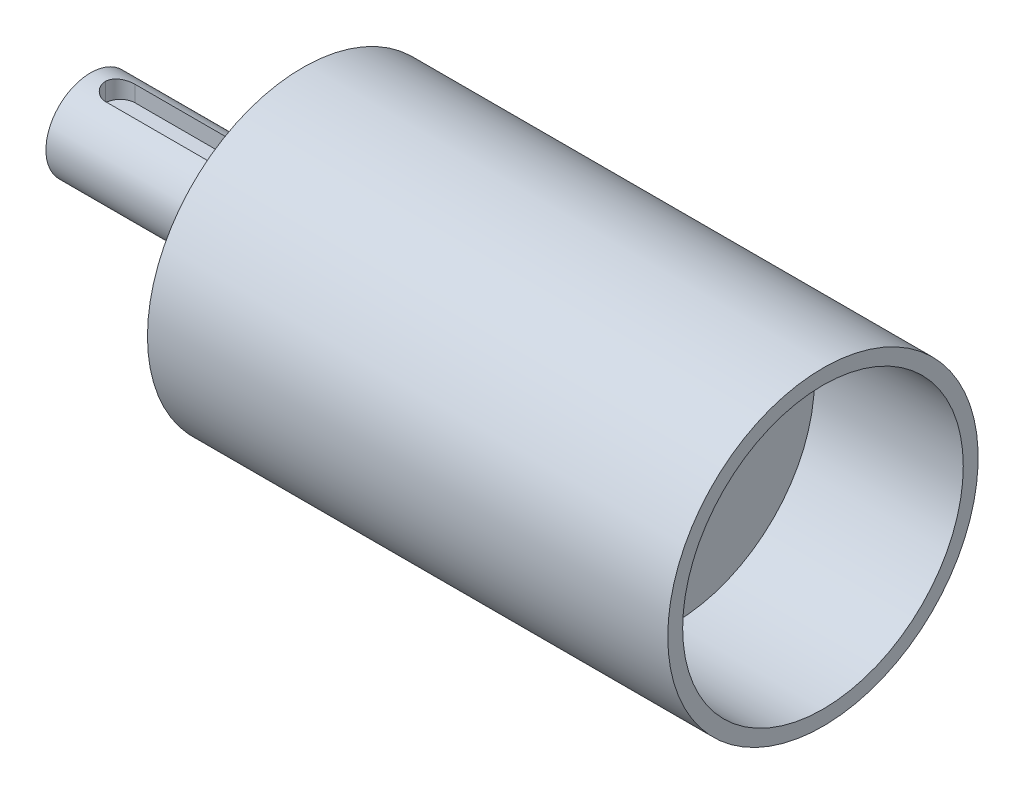
ISO-10303-21;
HEADER;
FILE_DESCRIPTION(('STEP AP214'),'2;1');
FILE_NAME('part.step','',(''),(''),'','','');
FILE_SCHEMA(('AUTOMOTIVE_DESIGN { 1 0 10303 214 1 1 1 1 }'));
ENDSEC;
DATA;
#1=APPLICATION_CONTEXT('core data for automotive mechanical design processes');
#2=APPLICATION_PROTOCOL_DEFINITION('international standard','automotive_design',2000,#1);
#3=PRODUCT_CONTEXT('',#1,'mechanical');
#4=PRODUCT('Part','Part','',(#3));
#5=PRODUCT_RELATED_PRODUCT_CATEGORY('part','',(#4));
#6=PRODUCT_DEFINITION_FORMATION('','',#4);
#7=PRODUCT_DEFINITION_CONTEXT('part definition',#1,'design');
#8=PRODUCT_DEFINITION('design','',#6,#7);
#9=PRODUCT_DEFINITION_SHAPE('','',#8);
#10=(LENGTH_UNIT() NAMED_UNIT(*) SI_UNIT(.MILLI.,.METRE.));
#11=(NAMED_UNIT(*) PLANE_ANGLE_UNIT() SI_UNIT($,.RADIAN.));
#12=(NAMED_UNIT(*) SI_UNIT($,.STERADIAN.) SOLID_ANGLE_UNIT());
#13=UNCERTAINTY_MEASURE_WITH_UNIT(LENGTH_MEASURE(1.E-05),#10,'distance_accuracy_value','');
#14=(GEOMETRIC_REPRESENTATION_CONTEXT(3) GLOBAL_UNCERTAINTY_ASSIGNED_CONTEXT((#13)) GLOBAL_UNIT_ASSIGNED_CONTEXT((#10,
#11,#12)) REPRESENTATION_CONTEXT('',''));
#15=CARTESIAN_POINT('',(0.,0.,0.));
#16=DIRECTION('',(0.,0.,1.));
#17=DIRECTION('',(1.,0.,0.));
#18=AXIS2_PLACEMENT_3D('',#15,#16,#17);
#19=CARTESIAN_POINT('',(25.9,0.,0.));
#20=DIRECTION('',(-1.,0.,0.));
#21=DIRECTION('',(0.,0.,1.));
#22=AXIS2_PLACEMENT_3D('',#19,#20,#21);
#23=CYLINDRICAL_SURFACE('',#22,5.99);
#24=CARTESIAN_POINT('',(0.,0.,0.));
#25=DIRECTION('',(1.,0.,0.));
#26=DIRECTION('',(0.,0.,-1.));
#27=AXIS2_PLACEMENT_3D('',#24,#25,#26);
#28=CIRCLE('',#27,5.99);
#29=CARTESIAN_POINT('',(0.,0.,-5.99));
#30=VERTEX_POINT('',#29);
#31=EDGE_CURVE('E118',#30,#30,#28,.T.);
#32=ORIENTED_EDGE('',*,*,#31,.T.);
#33=EDGE_LOOP('',(#32));
#34=FACE_BOUND('',#33,.T.);
#35=CARTESIAN_POINT('',(25.9,0.,0.));
#36=DIRECTION('',(1.,0.,0.));
#37=DIRECTION('',(0.,0.,-1.));
#38=AXIS2_PLACEMENT_3D('',#35,#36,#37);
#39=CIRCLE('',#38,5.99);
#40=CARTESIAN_POINT('',(25.9,0.,-5.99));
#41=VERTEX_POINT('',#40);
#42=EDGE_CURVE('E114',#41,#41,#39,.T.);
#43=ORIENTED_EDGE('',*,*,#42,.F.);
#44=EDGE_LOOP('',(#43));
#45=FACE_BOUND('',#44,.T.);
#46=CARTESIAN_POINT('',(20.,5.64624654084464,-2.));
#47=CARTESIAN_POINT('',(20.0545772254101,5.64624111920466,-2.00000150142005));
#48=CARTESIAN_POINT('',(20.1091265843497,5.64703886653188,-1.99776455751104));
#49=CARTESIAN_POINT('',(20.2178019552134,5.65018567229273,-1.98885277168999));
#50=CARTESIAN_POINT('',(20.2719280777978,5.65253431050127,-1.9821791319294));
#51=CARTESIAN_POINT('',(20.4327447969426,5.66180052844837,-1.95562915457593));
#52=CARTESIAN_POINT('',(20.5383057456413,5.67093927118224,-1.9292230365146));
#53=CARTESIAN_POINT('',(20.7431638927426,5.69403166927295,-1.85995042804286));
#54=CARTESIAN_POINT('',(20.842464423125,5.70798273733851,-1.81709278121317));
#55=CARTESIAN_POINT('',(21.0325566876376,5.73911751354651,-1.71621952255672));
#56=CARTESIAN_POINT('',(21.1233428197958,5.75630332791377,-1.6581940249353));
#57=CARTESIAN_POINT('',(21.2973029819165,5.79271898526574,-1.52621934176412));
#58=CARTESIAN_POINT('',(21.3800938350862,5.81199964668334,-1.4517792243794));
#59=CARTESIAN_POINT('',(21.5322845903454,5.85000481735862,-1.29012739459433));
#60=CARTESIAN_POINT('',(21.6016817814633,5.86872921337672,-1.20291310288123));
#61=CARTESIAN_POINT('',(21.7268783021557,5.90410855984005,-1.01535117190145));
#62=CARTESIAN_POINT('',(21.7822683075113,5.9206954770443,-0.914716623643645));
#63=CARTESIAN_POINT('',(21.875148896941,5.949312973737,-0.704943660362393));
#64=CARTESIAN_POINT('',(21.9126563774084,5.96134785201078,-0.595813386461911));
#65=CARTESIAN_POINT('',(21.9602197055108,5.97680587206533,-0.405169825918822));
#66=CARTESIAN_POINT('',(21.9751012829965,5.98171974860905,-0.32494936472452));
#67=CARTESIAN_POINT('',(21.9950044337159,5.988332022573,-0.163170084738659));
#68=CARTESIAN_POINT('',(22.0000263764121,5.99003054047981,-0.0816113162119529));
#69=CARTESIAN_POINT('',(22.,5.99,0.));
#70=B_SPLINE_CURVE_WITH_KNOTS('',3,(#46,#47,#48,#49,#50,#51,#52,#53,#54,#55,#56,#57,#58,#59,#60,
#61,#62,#63,#64,#65,#66,#67,#68,#69),.UNSPECIFIED.,.F.,.F.,(4,2,2,2,2,2,2,2,2,2,2,4),(0.,
0.163625649975165,0.327206982581535,0.65309094193572,0.978799965914939,1.30472180553101,
1.64217985811905,1.97970614312829,2.32618169449264,2.6723292247203,2.91690445867158,
3.16147052766792),.UNSPECIFIED.);
#71=CARTESIAN_POINT('',(20.,5.64624654084464,-2.));
#72=VERTEX_POINT('',#71);
#73=CARTESIAN_POINT('',(22.,5.99,0.));
#74=VERTEX_POINT('',#73);
#75=EDGE_CURVE('E46',#72,#74,#70,.T.);
#76=ORIENTED_EDGE('',*,*,#75,.T.);
#77=CARTESIAN_POINT('',(22.,5.99,0.));
#78=CARTESIAN_POINT('',(22.0000012730635,5.9900040463816,0.0546631956011673));
#79=CARTESIAN_POINT('',(21.9977574934421,5.98925084783282,0.109298825286019));
#80=CARTESIAN_POINT('',(21.9888169927915,5.98627319657744,0.218151728395362));
#81=CARTESIAN_POINT('',(21.9821212965911,5.98404908247545,0.272369095198684));
#82=CARTESIAN_POINT('',(21.955475799514,5.97525620693805,0.433492139770829));
#83=CARTESIAN_POINT('',(21.9289669434029,5.96656627217468,0.539274739359236));
#84=CARTESIAN_POINT('',(21.8593957563344,5.94444090336522,0.744589755395238));
#85=CARTESIAN_POINT('',(21.8163393678461,5.93100717302826,0.844124400667282));
#86=CARTESIAN_POINT('',(21.7150006865404,5.90076203468457,1.03460852898133));
#87=CARTESIAN_POINT('',(21.6567102589405,5.88394882318897,1.12555338975795));
#88=CARTESIAN_POINT('',(21.5244554079997,5.84806769798296,1.29935823327725));
#89=CARTESIAN_POINT('',(21.4500599782322,5.82894593254174,1.38187889993164));
#90=CARTESIAN_POINT('',(21.2886113548137,5.79089574943314,1.53354205263574));
#91=CARTESIAN_POINT('',(21.2015543226762,5.7719673922684,1.60268046685874));
#92=CARTESIAN_POINT('',(21.0141602716922,5.73584669067053,1.72757767514161));
#93=CARTESIAN_POINT('',(20.9135095906292,5.7187212167324,1.78288658986049));
#94=CARTESIAN_POINT('',(20.7037123553614,5.68898699919098,1.87560944389763));
#95=CARTESIAN_POINT('',(20.594574951974,5.67637347058264,1.91304235526658));
#96=CARTESIAN_POINT('',(20.4041290335461,5.66014810164415,1.96042434317734));
#97=CARTESIAN_POINT('',(20.3241294295472,5.65497757594384,1.97522659852044));
#98=CARTESIAN_POINT('',(20.162771976901,5.64800755829344,1.99502868659242));
#99=CARTESIAN_POINT('',(20.0814139111966,5.64620861036118,2.00002693741128));
#100=CARTESIAN_POINT('',(20.,5.64624654084464,2.));
#101=B_SPLINE_CURVE_WITH_KNOTS('',3,(#77,#78,#79,#80,#81,#82,#83,#84,#85,#86,#87,#88,#89,#90,
#91,#92,#93,#94,#95,#96,#97,#98,#99,#100),.UNSPECIFIED.,.F.,.F.,(4,2,2,2,2,2,2,2,2,2,2,4),(0.,
0.163884393610507,0.327731074174003,0.654222635814394,0.980597058790955,1.30714611890576,
1.64384880160505,1.98065377255439,2.32729817163841,2.67357385004657,2.91750200912948,
3.16146952362764),.UNSPECIFIED.);
#102=CARTESIAN_POINT('',(20.,5.64624654084464,2.));
#103=VERTEX_POINT('',#102);
#104=EDGE_CURVE('E11',#74,#103,#101,.T.);
#105=ORIENTED_EDGE('',*,*,#104,.T.);
#106=DIRECTION('',(-1.,0.,0.));
#107=VECTOR('',#106,1.);
#108=CARTESIAN_POINT('',(22.,5.64624654084464,2.));
#109=LINE('',#108,#107);
#110=CARTESIAN_POINT('',(4.,5.64624654084464,2.));
#111=VERTEX_POINT('',#110);
#112=EDGE_CURVE('E201',#103,#111,#109,.T.);
#113=ORIENTED_EDGE('',*,*,#112,.T.);
#114=CARTESIAN_POINT('',(4.,5.64624654084464,2.));
#115=CARTESIAN_POINT('',(3.94542277458986,5.64624111920466,2.00000150142005));
#116=CARTESIAN_POINT('',(3.8908734156503,5.64703886653188,1.99776455751104));
#117=CARTESIAN_POINT('',(3.7821980447866,5.65018567229273,1.98885277168999));
#118=CARTESIAN_POINT('',(3.72807192220219,5.65253431050127,1.98217913192941));
#119=CARTESIAN_POINT('',(3.56725520305736,5.66180052844837,1.95562915457593));
#120=CARTESIAN_POINT('',(3.46169425435872,5.67093927118224,1.9292230365146));
#121=CARTESIAN_POINT('',(3.25683610725737,5.69403166927295,1.85995042804286));
#122=CARTESIAN_POINT('',(3.15753557687499,5.70798273733851,1.81709278121317));
#123=CARTESIAN_POINT('',(2.96744331236241,5.73911751354651,1.71621952255672));
#124=CARTESIAN_POINT('',(2.8766571802042,5.75630332791377,1.6581940249353));
#125=CARTESIAN_POINT('',(2.70269701808346,5.79271898526574,1.52621934176412));
#126=CARTESIAN_POINT('',(2.61990616491383,5.81199964668334,1.4517792243794));
#127=CARTESIAN_POINT('',(2.4677154096546,5.85000481735862,1.29012739459433));
#128=CARTESIAN_POINT('',(2.39831821853666,5.86872921337672,1.20291310288123));
#129=CARTESIAN_POINT('',(2.27312169784431,5.90410855984005,1.01535117190145));
#130=CARTESIAN_POINT('',(2.21773169248871,5.9206954770443,0.914716623643644));
#131=CARTESIAN_POINT('',(2.12485110305897,5.949312973737,0.704943660362392));
#132=CARTESIAN_POINT('',(2.08734362259159,5.96134785201078,0.59581338646191));
#133=CARTESIAN_POINT('',(2.0397802944892,5.97680587206533,0.405169825918822));
#134=CARTESIAN_POINT('',(2.02489871700347,5.98171974860905,0.324949364724519));
#135=CARTESIAN_POINT('',(2.00499556628409,5.988332022573,0.163170084738659));
#136=CARTESIAN_POINT('',(1.99997362358791,5.99003054047981,0.0816113162119529));
#137=CARTESIAN_POINT('',(2.,5.99,0.));
#138=B_SPLINE_CURVE_WITH_KNOTS('',3,(#114,#115,#116,#117,#118,#119,#120,#121,#122,#123,#124,
#125,#126,#127,#128,#129,#130,#131,#132,#133,#134,#135,#136,#137),.UNSPECIFIED.,.F.,.F.,(4,2,2,
2,2,2,2,2,2,2,2,4),(0.,0.163625649975162,0.327206982581536,0.65309094193572,0.97879996591494,
1.30472180553101,1.64217985811905,1.97970614312829,2.32618169449264,2.6723292247203,
2.91690445867158,3.16147052766792),.UNSPECIFIED.);
#139=CARTESIAN_POINT('',(2.,5.99,0.));
#140=VERTEX_POINT('',#139);
#141=EDGE_CURVE('E58',#111,#140,#138,.T.);
#142=ORIENTED_EDGE('',*,*,#141,.T.);
#143=CARTESIAN_POINT('',(2.,5.99,0.));
#144=CARTESIAN_POINT('',(1.99999872693646,5.9900040463816,-0.0546631956011676));
#145=CARTESIAN_POINT('',(2.00224250655789,5.98925084783282,-0.109298825286019));
#146=CARTESIAN_POINT('',(2.01118300720854,5.98627319657744,-0.218151728395363));
#147=CARTESIAN_POINT('',(2.01787870340888,5.98404908247545,-0.272369095198685));
#148=CARTESIAN_POINT('',(2.04452420048597,5.97525620693805,-0.433492139770829));
#149=CARTESIAN_POINT('',(2.07103305659712,5.96656627217468,-0.539274739359236));
#150=CARTESIAN_POINT('',(2.14060424366565,5.94444090336522,-0.744589755395238));
#151=CARTESIAN_POINT('',(2.18366063215393,5.93100717302826,-0.844124400667282));
#152=CARTESIAN_POINT('',(2.2849993134596,5.90076203468457,-1.03460852898133));
#153=CARTESIAN_POINT('',(2.34328974105949,5.88394882318897,-1.12555338975795));
#154=CARTESIAN_POINT('',(2.47554459200028,5.84806769798296,-1.29935823327725));
#155=CARTESIAN_POINT('',(2.54994002176778,5.82894593254174,-1.38187889993164));
#156=CARTESIAN_POINT('',(2.71138864518628,5.79089574943314,-1.53354205263574));
#157=CARTESIAN_POINT('',(2.79844567732382,5.7719673922684,-1.60268046685874));
#158=CARTESIAN_POINT('',(2.98583972830781,5.73584669067053,-1.72757767514161));
#159=CARTESIAN_POINT('',(3.08649040937084,5.7187212167324,-1.78288658986049));
#160=CARTESIAN_POINT('',(3.2962876446386,5.68898699919098,-1.87560944389763));
#161=CARTESIAN_POINT('',(3.40542504802598,5.67637347058264,-1.91304235526658));
#162=CARTESIAN_POINT('',(3.5958709664539,5.66014810164415,-1.96042434317734));
#163=CARTESIAN_POINT('',(3.67587057045277,5.65497757594384,-1.97522659852044));
#164=CARTESIAN_POINT('',(3.83722802309902,5.64800755829344,-1.99502868659242));
#165=CARTESIAN_POINT('',(3.91858608880343,5.64620861036118,-2.00002693741128));
#166=CARTESIAN_POINT('',(4.,5.64624654084464,-2.));
#167=B_SPLINE_CURVE_WITH_KNOTS('',3,(#143,#144,#145,#146,#147,#148,#149,#150,#151,#152,#153,
#154,#155,#156,#157,#158,#159,#160,#161,#162,#163,#164,#165,#166),.UNSPECIFIED.,.F.,.F.,(4,2,2,
2,2,2,2,2,2,2,2,4),(0.,0.163884393610507,0.327731074174003,0.654222635814394,0.980597058790955,
1.30714611890576,1.64384880160505,1.98065377255439,2.32729817163841,2.67357385004657,
2.91750200912948,3.16146952362764),.UNSPECIFIED.);
#168=CARTESIAN_POINT('',(4.,5.64624654084464,-2.));
#169=VERTEX_POINT('',#168);
#170=EDGE_CURVE('E130',#140,#169,#167,.T.);
#171=ORIENTED_EDGE('',*,*,#170,.T.);
#172=DIRECTION('',(-1.,0.,0.));
#173=VECTOR('',#172,1.);
#174=CARTESIAN_POINT('',(22.,5.64624654084464,-2.));
#175=LINE('',#174,#173);
#176=EDGE_CURVE('E111',#72,#169,#175,.T.);
#177=ORIENTED_EDGE('',*,*,#176,.F.);
#178=EDGE_LOOP('',(#76,#105,#113,#142,#171,#177));
#179=FACE_BOUND('',#178,.T.);
#180=ADVANCED_FACE('F34',(#34,#45,#179),#23,.T.);
#181=CARTESIAN_POINT('',(0.,0.,0.));
#182=DIRECTION('',(1.,0.,0.));
#183=DIRECTION('',(0.,0.,-1.));
#184=AXIS2_PLACEMENT_3D('',#181,#182,#183);
#185=PLANE('',#184);
#186=ORIENTED_EDGE('',*,*,#31,.F.);
#187=EDGE_LOOP('',(#186));
#188=FACE_BOUND('',#187,.T.);
#189=ADVANCED_FACE('F176',(#188),#185,.F.);
#190=CARTESIAN_POINT('',(25.9,0.,0.));
#191=DIRECTION('',(1.,0.,0.));
#192=DIRECTION('',(0.,0.,-1.));
#193=AXIS2_PLACEMENT_3D('',#190,#191,#192);
#194=PLANE('',#193);
#195=CARTESIAN_POINT('',(25.9,0.,0.));
#196=DIRECTION('',(1.,0.,0.));
#197=DIRECTION('',(0.,0.,-1.));
#198=AXIS2_PLACEMENT_3D('',#195,#196,#197);
#199=CIRCLE('',#198,13.985);
#200=CARTESIAN_POINT('',(25.9,0.,-13.985));
#201=VERTEX_POINT('',#200);
#202=EDGE_CURVE('E190',#201,#201,#199,.T.);
#203=ORIENTED_EDGE('',*,*,#202,.F.);
#204=EDGE_LOOP('',(#203));
#205=FACE_BOUND('',#204,.T.);
#206=ORIENTED_EDGE('',*,*,#42,.T.);
#207=EDGE_LOOP('',(#206));
#208=FACE_BOUND('',#207,.T.);
#209=ADVANCED_FACE('F173',(#205,#208),#194,.F.);
#210=CARTESIAN_POINT('',(28.5,0.,0.));
#211=DIRECTION('',(-1.,0.,0.));
#212=DIRECTION('',(0.,0.,1.));
#213=AXIS2_PLACEMENT_3D('',#210,#211,#212);
#214=CYLINDRICAL_SURFACE('',#213,13.985);
#215=CARTESIAN_POINT('',(28.5,0.,0.));
#216=DIRECTION('',(1.,0.,0.));
#217=DIRECTION('',(0.,0.,-1.));
#218=AXIS2_PLACEMENT_3D('',#215,#216,#217);
#219=CIRCLE('',#218,13.985);
#220=CARTESIAN_POINT('',(28.5,0.,-13.985));
#221=VERTEX_POINT('',#220);
#222=EDGE_CURVE('E188',#221,#221,#219,.T.);
#223=ORIENTED_EDGE('',*,*,#222,.F.);
#224=EDGE_LOOP('',(#223));
#225=FACE_BOUND('',#224,.T.);
#226=ORIENTED_EDGE('',*,*,#202,.T.);
#227=EDGE_LOOP('',(#226));
#228=FACE_BOUND('',#227,.T.);
#229=ADVANCED_FACE('F165',(#225,#228),#214,.T.);
#230=CARTESIAN_POINT('',(28.5,0.,0.));
#231=DIRECTION('',(1.,0.,0.));
#232=DIRECTION('',(0.,0.,-1.));
#233=AXIS2_PLACEMENT_3D('',#230,#231,#232);
#234=PLANE('',#233);
#235=CARTESIAN_POINT('',(28.5,1.83302876458243E-13,-17.5));
#236=DIRECTION('',(-1.,0.,0.));
#237=DIRECTION('',(0.,0.,1.));
#238=AXIS2_PLACEMENT_3D('',#235,#236,#237);
#239=CIRCLE('',#238,2.);
#240=CARTESIAN_POINT('',(28.5,1.83302876458243E-13,-15.5));
#241=VERTEX_POINT('',#240);
#242=EDGE_CURVE('E232',#241,#241,#239,.T.);
#243=ORIENTED_EDGE('',*,*,#242,.F.);
#244=EDGE_LOOP('',(#243));
#245=FACE_BOUND('',#244,.T.);
#246=CARTESIAN_POINT('',(28.5,-17.5,-1.22201917638828E-13));
#247=DIRECTION('',(-1.,0.,0.));
#248=DIRECTION('',(0.,0.,1.));
#249=AXIS2_PLACEMENT_3D('',#246,#247,#248);
#250=CIRCLE('',#249,2.);
#251=CARTESIAN_POINT('',(28.5,-17.5,1.99999999999988));
#252=VERTEX_POINT('',#251);
#253=EDGE_CURVE('E226',#252,#252,#250,.T.);
#254=ORIENTED_EDGE('',*,*,#253,.F.);
#255=EDGE_LOOP('',(#254));
#256=FACE_BOUND('',#255,.T.);
#257=CARTESIAN_POINT('',(28.5,0.,17.5));
#258=DIRECTION('',(-1.,0.,0.));
#259=DIRECTION('',(0.,0.,1.));
#260=AXIS2_PLACEMENT_3D('',#257,#258,#259);
#261=CIRCLE('',#260,2.);
#262=CARTESIAN_POINT('',(28.5,0.,19.5));
#263=VERTEX_POINT('',#262);
#264=EDGE_CURVE('E220',#263,#263,#261,.T.);
#265=ORIENTED_EDGE('',*,*,#264,.F.);
#266=EDGE_LOOP('',(#265));
#267=FACE_BOUND('',#266,.T.);
#268=CARTESIAN_POINT('',(28.5,17.5,0.));
#269=DIRECTION('',(-1.,0.,0.));
#270=DIRECTION('',(0.,0.,1.));
#271=AXIS2_PLACEMENT_3D('',#268,#269,#270);
#272=CIRCLE('',#271,2.);
#273=CARTESIAN_POINT('',(28.5,17.5,2.));
#274=VERTEX_POINT('',#273);
#275=EDGE_CURVE('E214',#274,#274,#272,.T.);
#276=ORIENTED_EDGE('',*,*,#275,.F.);
#277=EDGE_LOOP('',(#276));
#278=FACE_BOUND('',#277,.T.);
#279=CARTESIAN_POINT('',(28.5,0.,0.));
#280=DIRECTION('',(1.,0.,0.));
#281=DIRECTION('',(0.,0.,-1.));
#282=AXIS2_PLACEMENT_3D('',#279,#280,#281);
#283=CIRCLE('',#282,20.85);
#284=CARTESIAN_POINT('',(28.5,0.,20.85));
#285=VERTEX_POINT('',#284);
#286=EDGE_CURVE('E198',#285,#285,#283,.T.);
#287=ORIENTED_EDGE('',*,*,#286,.F.);
#288=EDGE_LOOP('',(#287));
#289=FACE_BOUND('',#288,.T.);
#290=ORIENTED_EDGE('',*,*,#222,.T.);
#291=EDGE_LOOP('',(#290));
#292=FACE_BOUND('',#291,.T.);
#293=ADVANCED_FACE('F161',(#245,#256,#267,#278,#289,#292),#234,.F.);
#294=CARTESIAN_POINT('',(98.4,0.,0.));
#295=DIRECTION('',(-1.,0.,0.));
#296=DIRECTION('',(0.,0.,1.));
#297=AXIS2_PLACEMENT_3D('',#294,#295,#296);
#298=CYLINDRICAL_SURFACE('',#297,20.85);
#299=CARTESIAN_POINT('',(98.4,0.,0.));
#300=DIRECTION('',(1.,0.,0.));
#301=DIRECTION('',(0.,0.,-1.));
#302=AXIS2_PLACEMENT_3D('',#299,#300,#301);
#303=CIRCLE('',#302,20.85);
#304=CARTESIAN_POINT('',(98.4,0.,20.85));
#305=VERTEX_POINT('',#304);
#306=EDGE_CURVE('E195',#305,#305,#303,.T.);
#307=CARTESIAN_POINT('',(98.4,0.,20.85));
#308=CARTESIAN_POINT('',(97.671875,0.,20.85));
#309=CARTESIAN_POINT('',(96.94375,0.,20.85));
#310=CARTESIAN_POINT('',(95.4875,0.,20.85));
#311=CARTESIAN_POINT('',(94.759375,0.,20.85));
#312=CARTESIAN_POINT('',(93.303125,0.,20.85));
#313=CARTESIAN_POINT('',(92.575,0.,20.85));
#314=CARTESIAN_POINT('',(91.11875,0.,20.85));
#315=CARTESIAN_POINT('',(90.390625,0.,20.85));
#316=CARTESIAN_POINT('',(88.934375,0.,20.85));
#317=CARTESIAN_POINT('',(88.20625,0.,20.85));
#318=CARTESIAN_POINT('',(86.75,0.,20.85));
#319=CARTESIAN_POINT('',(86.021875,0.,20.85));
#320=CARTESIAN_POINT('',(84.565625,0.,20.85));
#321=CARTESIAN_POINT('',(83.8375,0.,20.85));
#322=CARTESIAN_POINT('',(82.38125,0.,20.85));
#323=CARTESIAN_POINT('',(81.653125,0.,20.85));
#324=CARTESIAN_POINT('',(80.196875,0.,20.85));
#325=CARTESIAN_POINT('',(79.46875,0.,20.85));
#326=CARTESIAN_POINT('',(78.0125,0.,20.85));
#327=CARTESIAN_POINT('',(77.284375,0.,20.85));
#328=CARTESIAN_POINT('',(75.828125,0.,20.85));
#329=CARTESIAN_POINT('',(75.1,0.,20.85));
#330=CARTESIAN_POINT('',(73.64375,0.,20.85));
#331=CARTESIAN_POINT('',(72.915625,0.,20.85));
#332=CARTESIAN_POINT('',(71.459375,0.,20.85));
#333=CARTESIAN_POINT('',(70.73125,0.,20.85));
#334=CARTESIAN_POINT('',(69.275,0.,20.85));
#335=CARTESIAN_POINT('',(68.546875,0.,20.85));
#336=CARTESIAN_POINT('',(67.090625,0.,20.85));
#337=CARTESIAN_POINT('',(66.3625,0.,20.85));
#338=CARTESIAN_POINT('',(64.90625,0.,20.85));
#339=CARTESIAN_POINT('',(64.178125,0.,20.85));
#340=CARTESIAN_POINT('',(62.721875,0.,20.85));
#341=CARTESIAN_POINT('',(61.99375,0.,20.85));
#342=CARTESIAN_POINT('',(60.5375,0.,20.85));
#343=CARTESIAN_POINT('',(59.809375,0.,20.85));
#344=CARTESIAN_POINT('',(58.353125,0.,20.85));
#345=CARTESIAN_POINT('',(57.625,0.,20.85));
#346=CARTESIAN_POINT('',(56.16875,0.,20.85));
#347=CARTESIAN_POINT('',(55.440625,0.,20.85));
#348=CARTESIAN_POINT('',(53.984375,0.,20.85));
#349=CARTESIAN_POINT('',(53.25625,0.,20.85));
#350=CARTESIAN_POINT('',(51.8,0.,20.85));
#351=CARTESIAN_POINT('',(51.071875,0.,20.85));
#352=CARTESIAN_POINT('',(49.615625,0.,20.85));
#353=CARTESIAN_POINT('',(48.8875,0.,20.85));
#354=CARTESIAN_POINT('',(47.43125,0.,20.85));
#355=CARTESIAN_POINT('',(46.703125,0.,20.85));
#356=CARTESIAN_POINT('',(45.246875,0.,20.85));
#357=CARTESIAN_POINT('',(44.51875,0.,20.85));
#358=CARTESIAN_POINT('',(43.0625,0.,20.85));
#359=CARTESIAN_POINT('',(42.334375,0.,20.85));
#360=CARTESIAN_POINT('',(40.878125,0.,20.85));
#361=CARTESIAN_POINT('',(40.15,0.,20.85));
#362=CARTESIAN_POINT('',(38.69375,0.,20.85));
#363=CARTESIAN_POINT('',(37.965625,0.,20.85));
#364=CARTESIAN_POINT('',(36.509375,0.,20.85));
#365=CARTESIAN_POINT('',(35.78125,0.,20.85));
#366=CARTESIAN_POINT('',(34.325,0.,20.85));
#367=CARTESIAN_POINT('',(33.596875,0.,20.85));
#368=CARTESIAN_POINT('',(32.140625,0.,20.85));
#369=CARTESIAN_POINT('',(31.4125,0.,20.85));
#370=CARTESIAN_POINT('',(29.95625,0.,20.85));
#371=CARTESIAN_POINT('',(29.228125,0.,20.85));
#372=CARTESIAN_POINT('',(28.5,0.,20.85));
#373=B_SPLINE_CURVE_WITH_KNOTS('',3,(#307,#308,#309,#310,#311,#312,#313,#314,#315,#316,#317,
#318,#319,#320,#321,#322,#323,#324,#325,#326,#327,#328,#329,#330,#331,#332,#333,#334,#335,#336,
#337,#338,#339,#340,#341,#342,#343,#344,#345,#346,#347,#348,#349,#350,#351,#352,#353,#354,#355,
#356,#357,#358,#359,#360,#361,#362,#363,#364,#365,#366,#367,#368,#369,#370,#371,#372),
.UNSPECIFIED.,.F.,.F.,(4,2,2,2,2,2,2,2,2,2,2,2,2,2,2,2,2,2,2,2,2,2,2,2,2,2,2,2,2,2,2,2,4),(0.,
2.18437499999999,4.36874999999999,6.55312499999999,8.7375,10.921875,13.10625,15.290625,17.475,
19.659375,21.84375,24.028125,26.2125,28.396875,30.58125,32.765625,34.95,37.134375,39.31875,
41.503125,43.6875,45.871875,48.05625,50.240625,52.425,54.609375,56.79375,58.978125,61.1625,
63.346875,65.53125,67.715625,69.9),.UNSPECIFIED.);
#374=EDGE_CURVE('BSEAM164',#305,#285,#373,.T.);
#375=ORIENTED_EDGE('',*,*,#306,.F.);
#376=ORIENTED_EDGE('',*,*,#286,.T.);
#377=ORIENTED_EDGE('',*,*,#374,.T.);
#378=ORIENTED_EDGE('',*,*,#374,.F.);
#379=EDGE_LOOP('',(#375,#377,#376,#378));
#380=FACE_BOUND('',#379,.T.);
#381=ADVANCED_FACE('F164',(#380),#298,.T.);
#382=CARTESIAN_POINT('',(98.4,0.,0.));
#383=DIRECTION('',(1.,0.,0.));
#384=DIRECTION('',(0.,0.,-1.));
#385=AXIS2_PLACEMENT_3D('',#382,#383,#384);
#386=PLANE('',#385);
#387=CARTESIAN_POINT('',(98.4,0.,0.));
#388=DIRECTION('',(1.,0.,0.));
#389=DIRECTION('',(0.,0.,-1.));
#390=AXIS2_PLACEMENT_3D('',#387,#388,#389);
#391=CIRCLE('',#390,18.85);
#392=CARTESIAN_POINT('',(98.4,0.,-18.85));
#393=VERTEX_POINT('',#392);
#394=EDGE_CURVE('E238',#393,#393,#391,.T.);
#395=ORIENTED_EDGE('',*,*,#394,.F.);
#396=EDGE_LOOP('',(#395));
#397=FACE_BOUND('',#396,.T.);
#398=ORIENTED_EDGE('',*,*,#306,.T.);
#399=EDGE_LOOP('',(#398));
#400=FACE_BOUND('',#399,.T.);
#401=ADVANCED_FACE('F155',(#397,#400),#386,.T.);
#402=CARTESIAN_POINT('',(22.,-13.3194213562373,2.00000000000001));
#403=DIRECTION('',(0.,0.,1.));
#404=DIRECTION('',(0.,-1.,0.));
#405=AXIS2_PLACEMENT_3D('',#402,#403,#404);
#406=PLANE('',#405);
#407=DIRECTION('',(-1.,0.,0.));
#408=VECTOR('',#407,1.);
#409=CARTESIAN_POINT('',(22.,3.49,2.));
#410=LINE('',#409,#408);
#411=CARTESIAN_POINT('',(20.,3.49,2.));
#412=VERTEX_POINT('',#411);
#413=CARTESIAN_POINT('',(4.,3.49,2.));
#414=VERTEX_POINT('',#413);
#415=EDGE_CURVE('E110',#412,#414,#410,.T.);
#416=ORIENTED_EDGE('',*,*,#415,.T.);
#417=DIRECTION('',(0.,1.,0.));
#418=VECTOR('',#417,1.);
#419=CARTESIAN_POINT('',(4.,5.64624654084464,2.));
#420=LINE('',#419,#418);
#421=EDGE_CURVE('E128',#414,#111,#420,.T.);
#422=ORIENTED_EDGE('',*,*,#421,.T.);
#423=ORIENTED_EDGE('',*,*,#112,.F.);
#424=DIRECTION('',(0.,1.,0.));
#425=VECTOR('',#424,1.);
#426=CARTESIAN_POINT('',(20.,-13.3194213562373,2.00000000000001));
#427=LINE('',#426,#425);
#428=EDGE_CURVE('E126',#103,#412,#427,.F.);
#429=ORIENTED_EDGE('',*,*,#428,.T.);
#430=EDGE_LOOP('',(#416,#422,#423,#429));
#431=FACE_BOUND('',#430,.T.);
#432=ADVANCED_FACE('F152',(#431),#406,.F.);
#433=CARTESIAN_POINT('',(22.,3.49,0.));
#434=DIRECTION('',(0.,-1.,0.));
#435=DIRECTION('',(0.,0.,-1.));
#436=AXIS2_PLACEMENT_3D('',#433,#434,#435);
#437=PLANE('',#436);
#438=DIRECTION('',(-1.,0.,0.));
#439=VECTOR('',#438,1.);
#440=CARTESIAN_POINT('',(22.,3.49,-2.));
#441=LINE('',#440,#439);
#442=CARTESIAN_POINT('',(20.,3.49,-2.));
#443=VERTEX_POINT('',#442);
#444=CARTESIAN_POINT('',(4.,3.49,-2.));
#445=VERTEX_POINT('',#444);
#446=EDGE_CURVE('E92',#443,#445,#441,.T.);
#447=ORIENTED_EDGE('',*,*,#446,.T.);
#448=CARTESIAN_POINT('',(4.,3.49,0.));
#449=DIRECTION('',(0.,-1.,0.));
#450=DIRECTION('',(0.,0.,-1.));
#451=AXIS2_PLACEMENT_3D('',#448,#449,#450);
#452=CIRCLE('',#451,2.);
#453=CARTESIAN_POINT('',(2.,3.49,0.));
#454=VERTEX_POINT('',#453);
#455=EDGE_CURVE('E124',#445,#454,#452,.F.);
#456=ORIENTED_EDGE('',*,*,#455,.T.);
#457=CARTESIAN_POINT('',(4.,3.49,0.));
#458=DIRECTION('',(0.,-1.,0.));
#459=DIRECTION('',(0.,0.,-1.));
#460=AXIS2_PLACEMENT_3D('',#457,#458,#459);
#461=CIRCLE('',#460,2.);
#462=EDGE_CURVE('E100',#454,#414,#461,.F.);
#463=ORIENTED_EDGE('',*,*,#462,.T.);
#464=ORIENTED_EDGE('',*,*,#415,.F.);
#465=CARTESIAN_POINT('',(20.,3.49,0.));
#466=DIRECTION('',(0.,-1.,0.));
#467=DIRECTION('',(0.,0.,-1.));
#468=AXIS2_PLACEMENT_3D('',#465,#466,#467);
#469=CIRCLE('',#468,2.);
#470=CARTESIAN_POINT('',(22.,3.49,0.));
#471=VERTEX_POINT('',#470);
#472=EDGE_CURVE('E95',#412,#471,#469,.F.);
#473=ORIENTED_EDGE('',*,*,#472,.T.);
#474=CARTESIAN_POINT('',(20.,3.49,0.));
#475=DIRECTION('',(0.,-1.,0.));
#476=DIRECTION('',(0.,0.,-1.));
#477=AXIS2_PLACEMENT_3D('',#474,#475,#476);
#478=CIRCLE('',#477,2.);
#479=EDGE_CURVE('E89',#471,#443,#478,.F.);
#480=ORIENTED_EDGE('',*,*,#479,.T.);
#481=EDGE_LOOP('',(#447,#456,#463,#464,#473,#480));
#482=FACE_BOUND('',#481,.T.);
#483=ADVANCED_FACE('F91',(#482),#437,.F.);
#484=CARTESIAN_POINT('',(22.,-13.3194213562373,-2.));
#485=DIRECTION('',(0.,0.,-1.));
#486=DIRECTION('',(-1.,0.,0.));
#487=AXIS2_PLACEMENT_3D('',#484,#485,#486);
#488=PLANE('',#487);
#489=ORIENTED_EDGE('',*,*,#176,.T.);
#490=DIRECTION('',(0.,-1.,0.));
#491=VECTOR('',#490,1.);
#492=CARTESIAN_POINT('',(4.,3.49,-2.));
#493=LINE('',#492,#491);
#494=EDGE_CURVE('E109',#169,#445,#493,.T.);
#495=ORIENTED_EDGE('',*,*,#494,.T.);
#496=ORIENTED_EDGE('',*,*,#446,.F.);
#497=DIRECTION('',(0.,-1.,0.));
#498=VECTOR('',#497,1.);
#499=CARTESIAN_POINT('',(20.,-13.3194213562373,-2.));
#500=LINE('',#499,#498);
#501=EDGE_CURVE('E107',#443,#72,#500,.F.);
#502=ORIENTED_EDGE('',*,*,#501,.T.);
#503=EDGE_LOOP('',(#489,#495,#496,#502));
#504=FACE_BOUND('',#503,.T.);
#505=ADVANCED_FACE('F106',(#504),#488,.F.);
#506=CARTESIAN_POINT('',(4.,-13.3194213562373,0.));
#507=DIRECTION('',(0.,-1.,0.));
#508=DIRECTION('',(0.,0.,-1.));
#509=AXIS2_PLACEMENT_3D('',#506,#507,#508);
#510=CYLINDRICAL_SURFACE('',#509,2.);
#511=DIRECTION('',(0.,1.,0.));
#512=VECTOR('',#511,1.);
#513=CARTESIAN_POINT('',(2.,3.49,0.));
#514=LINE('',#513,#512);
#515=EDGE_CURVE('E202',#140,#454,#514,.F.);
#516=ORIENTED_EDGE('',*,*,#515,.F.);
#517=ORIENTED_EDGE('',*,*,#141,.F.);
#518=ORIENTED_EDGE('',*,*,#421,.F.);
#519=ORIENTED_EDGE('',*,*,#462,.F.);
#520=EDGE_LOOP('',(#516,#517,#518,#519));
#521=FACE_BOUND('',#520,.T.);
#522=ADVANCED_FACE('F144',(#521),#510,.F.);
#523=CARTESIAN_POINT('',(4.,-13.3194213562373,0.));
#524=DIRECTION('',(0.,1.,0.));
#525=DIRECTION('',(0.,0.,1.));
#526=AXIS2_PLACEMENT_3D('',#523,#524,#525);
#527=CYLINDRICAL_SURFACE('',#526,2.);
#528=ORIENTED_EDGE('',*,*,#170,.F.);
#529=ORIENTED_EDGE('',*,*,#515,.T.);
#530=ORIENTED_EDGE('',*,*,#455,.F.);
#531=ORIENTED_EDGE('',*,*,#494,.F.);
#532=EDGE_LOOP('',(#528,#529,#530,#531));
#533=FACE_BOUND('',#532,.T.);
#534=ADVANCED_FACE('F140',(#533),#527,.F.);
#535=CARTESIAN_POINT('',(20.,-13.3194213562373,0.));
#536=DIRECTION('',(0.,1.,0.));
#537=DIRECTION('',(0.,0.,1.));
#538=AXIS2_PLACEMENT_3D('',#535,#536,#537);
#539=CYLINDRICAL_SURFACE('',#538,2.);
#540=ORIENTED_EDGE('',*,*,#428,.F.);
#541=ORIENTED_EDGE('',*,*,#104,.F.);
#542=DIRECTION('',(0.,1.,0.));
#543=VECTOR('',#542,1.);
#544=CARTESIAN_POINT('',(22.,-13.3194213562373,0.));
#545=LINE('',#544,#543);
#546=EDGE_CURVE('E209',#471,#74,#545,.T.);
#547=ORIENTED_EDGE('',*,*,#546,.F.);
#548=ORIENTED_EDGE('',*,*,#472,.F.);
#549=EDGE_LOOP('',(#540,#541,#547,#548));
#550=FACE_BOUND('',#549,.T.);
#551=ADVANCED_FACE('F143',(#550),#539,.F.);
#552=CARTESIAN_POINT('',(20.,-13.3194213562373,0.));
#553=DIRECTION('',(0.,-1.,0.));
#554=DIRECTION('',(0.,0.,-1.));
#555=AXIS2_PLACEMENT_3D('',#552,#553,#554);
#556=CYLINDRICAL_SURFACE('',#555,2.);
#557=ORIENTED_EDGE('',*,*,#75,.F.);
#558=ORIENTED_EDGE('',*,*,#501,.F.);
#559=ORIENTED_EDGE('',*,*,#479,.F.);
#560=ORIENTED_EDGE('',*,*,#546,.T.);
#561=EDGE_LOOP('',(#557,#558,#559,#560));
#562=FACE_BOUND('',#561,.T.);
#563=ADVANCED_FACE('F113',(#562),#556,.F.);
#564=CARTESIAN_POINT('',(36.5,17.5,0.));
#565=DIRECTION('',(-1.,0.,0.));
#566=DIRECTION('',(0.,0.,1.));
#567=AXIS2_PLACEMENT_3D('',#564,#565,#566);
#568=CYLINDRICAL_SURFACE('',#567,2.);
#569=CARTESIAN_POINT('',(36.5,17.5,0.));
#570=DIRECTION('',(-1.,0.,0.));
#571=DIRECTION('',(0.,0.,1.));
#572=AXIS2_PLACEMENT_3D('',#569,#570,#571);
#573=CIRCLE('',#572,2.);
#574=CARTESIAN_POINT('',(36.5,17.5,2.));
#575=VERTEX_POINT('',#574);
#576=EDGE_CURVE('E211',#575,#575,#573,.T.);
#577=ORIENTED_EDGE('',*,*,#576,.F.);
#578=EDGE_LOOP('',(#577));
#579=FACE_BOUND('',#578,.T.);
#580=ORIENTED_EDGE('',*,*,#275,.T.);
#581=EDGE_LOOP('',(#580));
#582=FACE_BOUND('',#581,.T.);
#583=ADVANCED_FACE('F293',(#579,#582),#568,.F.);
#584=CARTESIAN_POINT('',(36.5,17.5,0.));
#585=DIRECTION('',(-1.,0.,0.));
#586=DIRECTION('',(0.,0.,1.));
#587=AXIS2_PLACEMENT_3D('',#584,#585,#586);
#588=PLANE('',#587);
#589=ORIENTED_EDGE('',*,*,#576,.T.);
#590=EDGE_LOOP('',(#589));
#591=FACE_BOUND('',#590,.T.);
#592=ADVANCED_FACE('F289',(#591),#588,.T.);
#593=CARTESIAN_POINT('',(36.5,0.,17.5));
#594=DIRECTION('',(-1.,0.,0.));
#595=DIRECTION('',(0.,0.,1.));
#596=AXIS2_PLACEMENT_3D('',#593,#594,#595);
#597=CYLINDRICAL_SURFACE('',#596,2.);
#598=CARTESIAN_POINT('',(36.5,0.,17.5));
#599=DIRECTION('',(-1.,0.,0.));
#600=DIRECTION('',(0.,0.,1.));
#601=AXIS2_PLACEMENT_3D('',#598,#599,#600);
#602=CIRCLE('',#601,2.);
#603=CARTESIAN_POINT('',(36.5,0.,19.5));
#604=VERTEX_POINT('',#603);
#605=EDGE_CURVE('E217',#604,#604,#602,.T.);
#606=ORIENTED_EDGE('',*,*,#605,.F.);
#607=EDGE_LOOP('',(#606));
#608=FACE_BOUND('',#607,.T.);
#609=ORIENTED_EDGE('',*,*,#264,.T.);
#610=EDGE_LOOP('',(#609));
#611=FACE_BOUND('',#610,.T.);
#612=ADVANCED_FACE('F285',(#608,#611),#597,.F.);
#613=CARTESIAN_POINT('',(36.5,0.,17.5));
#614=DIRECTION('',(-1.,0.,0.));
#615=DIRECTION('',(0.,0.,1.));
#616=AXIS2_PLACEMENT_3D('',#613,#614,#615);
#617=PLANE('',#616);
#618=ORIENTED_EDGE('',*,*,#605,.T.);
#619=EDGE_LOOP('',(#618));
#620=FACE_BOUND('',#619,.T.);
#621=ADVANCED_FACE('F281',(#620),#617,.T.);
#622=CARTESIAN_POINT('',(36.5,-17.5,-1.22201917638828E-13));
#623=DIRECTION('',(-1.,0.,0.));
#624=DIRECTION('',(0.,0.,1.));
#625=AXIS2_PLACEMENT_3D('',#622,#623,#624);
#626=CYLINDRICAL_SURFACE('',#625,2.);
#627=CARTESIAN_POINT('',(36.5,-17.5,-1.22201917638828E-13));
#628=DIRECTION('',(-1.,0.,0.));
#629=DIRECTION('',(0.,0.,1.));
#630=AXIS2_PLACEMENT_3D('',#627,#628,#629);
#631=CIRCLE('',#630,2.);
#632=CARTESIAN_POINT('',(36.5,-17.5,1.99999999999988));
#633=VERTEX_POINT('',#632);
#634=EDGE_CURVE('E223',#633,#633,#631,.T.);
#635=ORIENTED_EDGE('',*,*,#634,.F.);
#636=EDGE_LOOP('',(#635));
#637=FACE_BOUND('',#636,.T.);
#638=ORIENTED_EDGE('',*,*,#253,.T.);
#639=EDGE_LOOP('',(#638));
#640=FACE_BOUND('',#639,.T.);
#641=ADVANCED_FACE('F277',(#637,#640),#626,.F.);
#642=CARTESIAN_POINT('',(36.5,-17.5,-1.22201917638828E-13));
#643=DIRECTION('',(-1.,0.,0.));
#644=DIRECTION('',(0.,0.,1.));
#645=AXIS2_PLACEMENT_3D('',#642,#643,#644);
#646=PLANE('',#645);
#647=ORIENTED_EDGE('',*,*,#634,.T.);
#648=EDGE_LOOP('',(#647));
#649=FACE_BOUND('',#648,.T.);
#650=ADVANCED_FACE('F273',(#649),#646,.T.);
#651=CARTESIAN_POINT('',(36.5,1.83302876458243E-13,-17.5));
#652=DIRECTION('',(-1.,0.,0.));
#653=DIRECTION('',(0.,0.,1.));
#654=AXIS2_PLACEMENT_3D('',#651,#652,#653);
#655=CYLINDRICAL_SURFACE('',#654,2.);
#656=CARTESIAN_POINT('',(36.5,1.83302876458243E-13,-17.5));
#657=DIRECTION('',(-1.,0.,0.));
#658=DIRECTION('',(0.,0.,1.));
#659=AXIS2_PLACEMENT_3D('',#656,#657,#658);
#660=CIRCLE('',#659,2.);
#661=CARTESIAN_POINT('',(36.5,1.83302876458243E-13,-15.5));
#662=VERTEX_POINT('',#661);
#663=EDGE_CURVE('E229',#662,#662,#660,.T.);
#664=ORIENTED_EDGE('',*,*,#663,.F.);
#665=EDGE_LOOP('',(#664));
#666=FACE_BOUND('',#665,.T.);
#667=ORIENTED_EDGE('',*,*,#242,.T.);
#668=EDGE_LOOP('',(#667));
#669=FACE_BOUND('',#668,.T.);
#670=ADVANCED_FACE('F266',(#666,#669),#655,.F.);
#671=CARTESIAN_POINT('',(36.5,1.83302876458243E-13,-17.5));
#672=DIRECTION('',(-1.,0.,0.));
#673=DIRECTION('',(0.,0.,1.));
#674=AXIS2_PLACEMENT_3D('',#671,#672,#673);
#675=PLANE('',#674);
#676=ORIENTED_EDGE('',*,*,#663,.T.);
#677=EDGE_LOOP('',(#676));
#678=FACE_BOUND('',#677,.T.);
#679=ADVANCED_FACE('F257',(#678),#675,.T.);
#680=CARTESIAN_POINT('',(78.4,0.,0.));
#681=DIRECTION('',(1.,0.,0.));
#682=DIRECTION('',(0.,0.,-1.));
#683=AXIS2_PLACEMENT_3D('',#680,#681,#682);
#684=CYLINDRICAL_SURFACE('',#683,18.85);
#685=CARTESIAN_POINT('',(78.4,0.,0.));
#686=DIRECTION('',(1.,0.,0.));
#687=DIRECTION('',(0.,0.,-1.));
#688=AXIS2_PLACEMENT_3D('',#685,#686,#687);
#689=CIRCLE('',#688,18.85);
#690=CARTESIAN_POINT('',(78.4,0.,-18.85));
#691=VERTEX_POINT('',#690);
#692=EDGE_CURVE('E235',#691,#691,#689,.T.);
#693=ORIENTED_EDGE('',*,*,#692,.F.);
#694=EDGE_LOOP('',(#693));
#695=FACE_BOUND('',#694,.T.);
#696=ORIENTED_EDGE('',*,*,#394,.T.);
#697=EDGE_LOOP('',(#696));
#698=FACE_BOUND('',#697,.T.);
#699=ADVANCED_FACE('F242',(#695,#698),#684,.F.);
#700=CARTESIAN_POINT('',(78.4,0.,0.));
#701=DIRECTION('',(1.,0.,0.));
#702=DIRECTION('',(0.,0.,-1.));
#703=AXIS2_PLACEMENT_3D('',#700,#701,#702);
#704=PLANE('',#703);
#705=ORIENTED_EDGE('',*,*,#692,.T.);
#706=EDGE_LOOP('',(#705));
#707=FACE_BOUND('',#706,.T.);
#708=ADVANCED_FACE('F256',(#707),#704,.T.);
#709=CLOSED_SHELL('',(#180,#189,#209,#229,#293,#381,#401,#432,#483,#505,#522,#534,#551,#563,
#583,#592,#612,#621,#641,#650,#670,#679,#699,#708));
#710=MANIFOLD_SOLID_BREP('B2',#709);
#711=ADVANCED_BREP_SHAPE_REPRESENTATION('',(#18,#710),#14);
#712=SHAPE_DEFINITION_REPRESENTATION(#9,#711);
ENDSEC;
END-ISO-10303-21;
